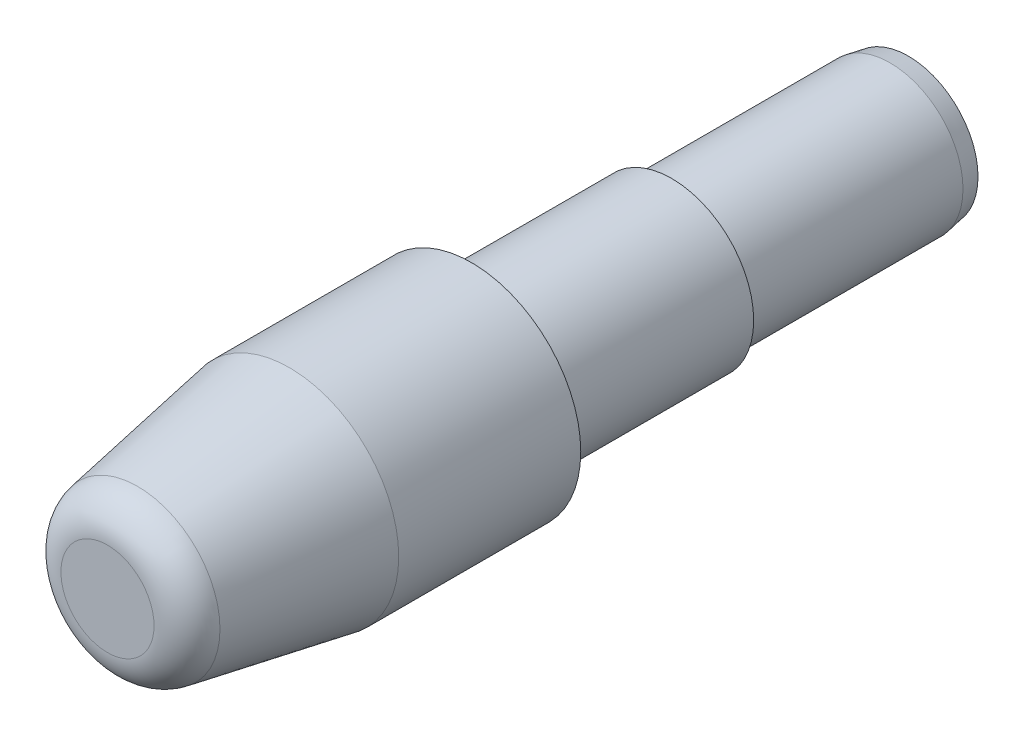
ISO-10303-21;
HEADER;
FILE_DESCRIPTION(('STEP AP214'),'2;1');
FILE_NAME('part.step','',(''),(''),'','','');
FILE_SCHEMA(('AUTOMOTIVE_DESIGN { 1 0 10303 214 1 1 1 1 }'));
ENDSEC;
DATA;
#1=APPLICATION_CONTEXT('core data for automotive mechanical design processes');
#2=APPLICATION_PROTOCOL_DEFINITION('international standard','automotive_design',2000,#1);
#3=PRODUCT_CONTEXT('',#1,'mechanical');
#4=PRODUCT('Part','Part','',(#3));
#5=PRODUCT_RELATED_PRODUCT_CATEGORY('part','',(#4));
#6=PRODUCT_DEFINITION_FORMATION('','',#4);
#7=PRODUCT_DEFINITION_CONTEXT('part definition',#1,'design');
#8=PRODUCT_DEFINITION('design','',#6,#7);
#9=PRODUCT_DEFINITION_SHAPE('','',#8);
#10=(LENGTH_UNIT() NAMED_UNIT(*) SI_UNIT(.MILLI.,.METRE.));
#11=(NAMED_UNIT(*) PLANE_ANGLE_UNIT() SI_UNIT($,.RADIAN.));
#12=(NAMED_UNIT(*) SI_UNIT($,.STERADIAN.) SOLID_ANGLE_UNIT());
#13=UNCERTAINTY_MEASURE_WITH_UNIT(LENGTH_MEASURE(1.E-05),#10,'distance_accuracy_value','');
#14=(GEOMETRIC_REPRESENTATION_CONTEXT(3) GLOBAL_UNCERTAINTY_ASSIGNED_CONTEXT((#13)) GLOBAL_UNIT_ASSIGNED_CONTEXT((#10,
#11,#12)) REPRESENTATION_CONTEXT('',''));
#15=CARTESIAN_POINT('',(0.,0.,0.));
#16=DIRECTION('',(0.,0.,1.));
#17=DIRECTION('',(1.,0.,0.));
#18=AXIS2_PLACEMENT_3D('',#15,#16,#17);
#19=CARTESIAN_POINT('',(0.,0.,-11.));
#20=DIRECTION('',(0.,0.,-1.));
#21=DIRECTION('',(-1.,0.,0.));
#22=AXIS2_PLACEMENT_3D('',#19,#20,#21);
#23=PLANE('',#22);
#24=CARTESIAN_POINT('',(0.,0.,-11.));
#25=DIRECTION('',(0.,0.,-1.));
#26=DIRECTION('',(-1.,0.,0.));
#27=AXIS2_PLACEMENT_3D('',#24,#25,#26);
#28=CIRCLE('',#27,4.5);
#29=CARTESIAN_POINT('',(-4.5,0.,-11.));
#30=VERTEX_POINT('',#29);
#31=EDGE_CURVE('E60',#30,#30,#28,.T.);
#32=ORIENTED_EDGE('',*,*,#31,.T.);
#33=EDGE_LOOP('',(#32));
#34=FACE_BOUND('',#33,.T.);
#35=CARTESIAN_POINT('',(0.,0.,-11.));
#36=DIRECTION('',(0.,0.,-1.));
#37=DIRECTION('',(-1.,0.,0.));
#38=AXIS2_PLACEMENT_3D('',#35,#36,#37);
#39=CIRCLE('',#38,4.);
#40=CARTESIAN_POINT('',(4.,0.,-11.));
#41=VERTEX_POINT('',#40);
#42=EDGE_CURVE('E63',#41,#41,#39,.T.);
#43=ORIENTED_EDGE('',*,*,#42,.F.);
#44=EDGE_LOOP('',(#43));
#45=FACE_BOUND('',#44,.T.);
#46=ADVANCED_FACE('F31',(#34,#45),#23,.T.);
#47=CARTESIAN_POINT('',(0.,0.,0.));
#48=DIRECTION('',(0.,0.,1.));
#49=DIRECTION('',(1.,0.,0.));
#50=AXIS2_PLACEMENT_3D('',#47,#48,#49);
#51=PLANE('',#50);
#52=CARTESIAN_POINT('',(0.,0.,0.));
#53=DIRECTION('',(0.,0.,1.));
#54=DIRECTION('',(1.,0.,0.));
#55=AXIS2_PLACEMENT_3D('',#52,#53,#54);
#56=CIRCLE('',#55,6.);
#57=CARTESIAN_POINT('',(6.,0.,0.));
#58=VERTEX_POINT('',#57);
#59=EDGE_CURVE('E57',#58,#58,#56,.T.);
#60=ORIENTED_EDGE('',*,*,#59,.F.);
#61=EDGE_LOOP('',(#60));
#62=FACE_BOUND('',#61,.T.);
#63=CARTESIAN_POINT('',(0.,0.,0.));
#64=DIRECTION('',(0.,0.,1.));
#65=DIRECTION('',(1.,0.,0.));
#66=AXIS2_PLACEMENT_3D('',#63,#64,#65);
#67=CIRCLE('',#66,4.5);
#68=CARTESIAN_POINT('',(4.5,0.,0.));
#69=VERTEX_POINT('',#68);
#70=EDGE_CURVE('E42',#69,#69,#67,.F.);
#71=ORIENTED_EDGE('',*,*,#70,.F.);
#72=EDGE_LOOP('',(#71));
#73=FACE_BOUND('',#72,.T.);
#74=ADVANCED_FACE('F70',(#62,#73),#51,.F.);
#75=CARTESIAN_POINT('',(0.,0.,10.));
#76=DIRECTION('',(0.,0.,-1.));
#77=DIRECTION('',(-1.,0.,0.));
#78=AXIS2_PLACEMENT_3D('',#75,#76,#77);
#79=CYLINDRICAL_SURFACE('',#78,6.);
#80=CARTESIAN_POINT('',(0.,0.,9.99999999999982));
#81=DIRECTION('',(0.,0.,1.));
#82=DIRECTION('',(1.,0.,0.));
#83=AXIS2_PLACEMENT_3D('',#80,#81,#82);
#84=CIRCLE('',#83,6.);
#85=CARTESIAN_POINT('',(6.,0.,9.99999999999982));
#86=VERTEX_POINT('',#85);
#87=EDGE_CURVE('E54',#86,#86,#84,.F.);
#88=ORIENTED_EDGE('',*,*,#87,.T.);
#89=EDGE_LOOP('',(#88));
#90=FACE_BOUND('',#89,.T.);
#91=ORIENTED_EDGE('',*,*,#59,.T.);
#92=EDGE_LOOP('',(#91));
#93=FACE_BOUND('',#92,.T.);
#94=ADVANCED_FACE('F76',(#90,#93),#79,.T.);
#95=CARTESIAN_POINT('',(0.,0.,20.));
#96=DIRECTION('',(0.,0.,1.));
#97=DIRECTION('',(1.,0.,0.));
#98=AXIS2_PLACEMENT_3D('',#95,#96,#97);
#99=PLANE('',#98);
#100=CARTESIAN_POINT('',(0.,0.,20.));
#101=DIRECTION('',(0.,0.,1.));
#102=DIRECTION('',(1.,0.,0.));
#103=AXIS2_PLACEMENT_3D('',#100,#101,#102);
#104=CIRCLE('',#103,2.55853093056079);
#105=CARTESIAN_POINT('',(2.55853093056079,0.,20.));
#106=VERTEX_POINT('',#105);
#107=EDGE_CURVE('E51',#106,#106,#104,.T.);
#108=ORIENTED_EDGE('',*,*,#107,.T.);
#109=EDGE_LOOP('',(#108));
#110=FACE_BOUND('',#109,.T.);
#111=ADVANCED_FACE('F87',(#110),#99,.T.);
#112=CARTESIAN_POINT('',(0.,0.,20.));
#113=DIRECTION('',(0.,0.,-1.));
#114=DIRECTION('',(-1.,0.,0.));
#115=AXIS2_PLACEMENT_3D('',#112,#113,#114);
#116=CONICAL_SURFACE('',#115,4.23673019291535,0.17453292519943);
#117=CARTESIAN_POINT('',(0.,0.,18.3472963553339));
#118=DIRECTION('',(0.,0.,1.));
#119=DIRECTION('',(1.,0.,0.));
#120=AXIS2_PLACEMENT_3D('',#117,#118,#119);
#121=CIRCLE('',#120,4.5281464365852);
#122=CARTESIAN_POINT('',(4.5281464365852,0.,18.3472963553339));
#123=VERTEX_POINT('',#122);
#124=EDGE_CURVE('E46',#123,#123,#121,.F.);
#125=ORIENTED_EDGE('',*,*,#124,.T.);
#126=EDGE_LOOP('',(#125));
#127=FACE_BOUND('',#126,.T.);
#128=ORIENTED_EDGE('',*,*,#87,.F.);
#129=EDGE_LOOP('',(#128));
#130=FACE_BOUND('',#129,.T.);
#131=ADVANCED_FACE('F89',(#127,#130),#116,.T.);
#132=CARTESIAN_POINT('',(0.,0.,18.));
#133=DIRECTION('',(0.,0.,1.));
#134=DIRECTION('',(1.,0.,0.));
#135=AXIS2_PLACEMENT_3D('',#132,#133,#134);
#136=TOROIDAL_SURFACE('',#135,2.55853093056079,2.);
#137=ORIENTED_EDGE('',*,*,#124,.F.);
#138=EDGE_LOOP('',(#137));
#139=FACE_BOUND('',#138,.T.);
#140=ORIENTED_EDGE('',*,*,#107,.F.);
#141=EDGE_LOOP('',(#140));
#142=FACE_BOUND('',#141,.T.);
#143=ADVANCED_FACE('F85',(#139,#142),#136,.T.);
#144=CARTESIAN_POINT('',(0.,0.,-11.));
#145=DIRECTION('',(0.,0.,1.));
#146=DIRECTION('',(1.,0.,0.));
#147=AXIS2_PLACEMENT_3D('',#144,#145,#146);
#148=CYLINDRICAL_SURFACE('',#147,4.5);
#149=ORIENTED_EDGE('',*,*,#31,.F.);
#150=EDGE_LOOP('',(#149));
#151=FACE_BOUND('',#150,.T.);
#152=ORIENTED_EDGE('',*,*,#70,.T.);
#153=EDGE_LOOP('',(#152));
#154=FACE_BOUND('',#153,.T.);
#155=ADVANCED_FACE('F82',(#151,#154),#148,.T.);
#156=CARTESIAN_POINT('',(0.,0.,-24.));
#157=DIRECTION('',(0.,0.,1.));
#158=DIRECTION('',(1.,0.,0.));
#159=AXIS2_PLACEMENT_3D('',#156,#157,#158);
#160=CYLINDRICAL_SURFACE('',#159,4.);
#161=CARTESIAN_POINT('',(0.,0.,-23.0000000000005));
#162=DIRECTION('',(0.,0.,-1.));
#163=DIRECTION('',(-1.,0.,0.));
#164=AXIS2_PLACEMENT_3D('',#161,#162,#163);
#165=CIRCLE('',#164,4.);
#166=CARTESIAN_POINT('',(4.,0.,-23.0000000000005));
#167=VERTEX_POINT('',#166);
#168=EDGE_CURVE('E10',#167,#167,#165,.F.);
#169=CARTESIAN_POINT('',(4.,0.,-23.0000000000005));
#170=CARTESIAN_POINT('',(4.,0.,-22.8750000000005));
#171=CARTESIAN_POINT('',(4.,0.,-22.7500000000004));
#172=CARTESIAN_POINT('',(4.,0.,-22.5000000000004));
#173=CARTESIAN_POINT('',(4.,0.,-22.3750000000004));
#174=CARTESIAN_POINT('',(4.,0.,-22.1250000000004));
#175=CARTESIAN_POINT('',(4.,0.,-22.0000000000004));
#176=CARTESIAN_POINT('',(4.,0.,-21.7500000000004));
#177=CARTESIAN_POINT('',(4.,0.,-21.6250000000004));
#178=CARTESIAN_POINT('',(4.,0.,-21.3750000000004));
#179=CARTESIAN_POINT('',(4.,0.,-21.2500000000004));
#180=CARTESIAN_POINT('',(4.,0.,-21.0000000000004));
#181=CARTESIAN_POINT('',(4.,0.,-20.8750000000004));
#182=CARTESIAN_POINT('',(4.,0.,-20.6250000000004));
#183=CARTESIAN_POINT('',(4.,0.,-20.5000000000004));
#184=CARTESIAN_POINT('',(4.,0.,-20.2500000000004));
#185=CARTESIAN_POINT('',(4.,0.,-20.1250000000003));
#186=CARTESIAN_POINT('',(4.,0.,-19.8750000000003));
#187=CARTESIAN_POINT('',(4.,0.,-19.7500000000003));
#188=CARTESIAN_POINT('',(4.,0.,-19.5000000000003));
#189=CARTESIAN_POINT('',(4.,0.,-19.3750000000003));
#190=CARTESIAN_POINT('',(4.,0.,-19.1250000000003));
#191=CARTESIAN_POINT('',(4.,0.,-19.0000000000003));
#192=CARTESIAN_POINT('',(4.,0.,-18.7500000000003));
#193=CARTESIAN_POINT('',(4.,0.,-18.6250000000003));
#194=CARTESIAN_POINT('',(4.,0.,-18.3750000000003));
#195=CARTESIAN_POINT('',(4.,0.,-18.2500000000003));
#196=CARTESIAN_POINT('',(4.,0.,-18.0000000000003));
#197=CARTESIAN_POINT('',(4.,0.,-17.8750000000003));
#198=CARTESIAN_POINT('',(4.,0.,-17.6250000000003));
#199=CARTESIAN_POINT('',(4.,0.,-17.5000000000002));
#200=CARTESIAN_POINT('',(4.,0.,-17.2500000000002));
#201=CARTESIAN_POINT('',(4.,0.,-17.1250000000002));
#202=CARTESIAN_POINT('',(4.,0.,-16.8750000000002));
#203=CARTESIAN_POINT('',(4.,0.,-16.7500000000002));
#204=CARTESIAN_POINT('',(4.,0.,-16.5000000000002));
#205=CARTESIAN_POINT('',(4.,0.,-16.3750000000002));
#206=CARTESIAN_POINT('',(4.,0.,-16.1250000000002));
#207=CARTESIAN_POINT('',(4.,0.,-16.0000000000002));
#208=CARTESIAN_POINT('',(4.,0.,-15.7500000000002));
#209=CARTESIAN_POINT('',(4.,0.,-15.6250000000002));
#210=CARTESIAN_POINT('',(4.,0.,-15.3750000000002));
#211=CARTESIAN_POINT('',(4.,0.,-15.2500000000002));
#212=CARTESIAN_POINT('',(4.,0.,-15.0000000000002));
#213=CARTESIAN_POINT('',(4.,0.,-14.8750000000001));
#214=CARTESIAN_POINT('',(4.,0.,-14.6250000000001));
#215=CARTESIAN_POINT('',(4.,0.,-14.5000000000001));
#216=CARTESIAN_POINT('',(4.,0.,-14.2500000000001));
#217=CARTESIAN_POINT('',(4.,0.,-14.1250000000001));
#218=CARTESIAN_POINT('',(4.,0.,-13.8750000000001));
#219=CARTESIAN_POINT('',(4.,0.,-13.7500000000001));
#220=CARTESIAN_POINT('',(4.,0.,-13.5000000000001));
#221=CARTESIAN_POINT('',(4.,0.,-13.3750000000001));
#222=CARTESIAN_POINT('',(4.,0.,-13.1250000000001));
#223=CARTESIAN_POINT('',(4.,0.,-13.0000000000001));
#224=CARTESIAN_POINT('',(4.,0.,-12.7500000000001));
#225=CARTESIAN_POINT('',(4.,0.,-12.6250000000001));
#226=CARTESIAN_POINT('',(4.,0.,-12.375));
#227=CARTESIAN_POINT('',(4.,0.,-12.25));
#228=CARTESIAN_POINT('',(4.,0.,-12.));
#229=CARTESIAN_POINT('',(4.,0.,-11.875));
#230=CARTESIAN_POINT('',(4.,0.,-11.625));
#231=CARTESIAN_POINT('',(4.,0.,-11.5));
#232=CARTESIAN_POINT('',(4.,0.,-11.25));
#233=CARTESIAN_POINT('',(4.,0.,-11.125));
#234=CARTESIAN_POINT('',(4.,0.,-11.));
#235=B_SPLINE_CURVE_WITH_KNOTS('',3,(#169,#170,#171,#172,#173,#174,#175,#176,#177,#178,#179,
#180,#181,#182,#183,#184,#185,#186,#187,#188,#189,#190,#191,#192,#193,#194,#195,#196,#197,#198,
#199,#200,#201,#202,#203,#204,#205,#206,#207,#208,#209,#210,#211,#212,#213,#214,#215,#216,#217,
#218,#219,#220,#221,#222,#223,#224,#225,#226,#227,#228,#229,#230,#231,#232,#233,#234),
.UNSPECIFIED.,.F.,.F.,(4,2,2,2,2,2,2,2,2,2,2,2,2,2,2,2,2,2,2,2,2,2,2,2,2,2,2,2,2,2,2,2,4),(0.,
0.375000000000014,0.750000000000028,1.12500000000004,1.50000000000006,1.87500000000007,
2.25000000000009,2.6250000000001,3.00000000000011,3.37500000000013,3.75000000000014,
4.12500000000016,4.50000000000017,4.87500000000018,5.2500000000002,5.62500000000021,
6.00000000000023,6.37500000000024,6.75000000000026,7.12500000000027,7.50000000000028,
7.8750000000003,8.25000000000031,8.62500000000033,9.00000000000034,9.37500000000036,
9.75000000000037,10.1250000000004,10.5000000000004,10.8750000000004,11.2500000000004,
11.6250000000004,12.0000000000005),.UNSPECIFIED.);
#236=EDGE_CURVE('BSEAM67',#167,#41,#235,.T.);
#237=ORIENTED_EDGE('',*,*,#168,.T.);
#238=ORIENTED_EDGE('',*,*,#42,.T.);
#239=ORIENTED_EDGE('',*,*,#236,.T.);
#240=ORIENTED_EDGE('',*,*,#236,.F.);
#241=EDGE_LOOP('',(#237,#239,#238,#240));
#242=FACE_BOUND('',#241,.T.);
#243=ADVANCED_FACE('F67',(#242),#160,.T.);
#244=CARTESIAN_POINT('',(0.,0.,-24.));
#245=DIRECTION('',(0.,0.,-1.));
#246=DIRECTION('',(-1.,0.,0.));
#247=AXIS2_PLACEMENT_3D('',#244,#245,#246);
#248=PLANE('',#247);
#249=CARTESIAN_POINT('',(0.,0.,-24.));
#250=DIRECTION('',(0.,0.,-1.));
#251=DIRECTION('',(-1.,0.,0.));
#252=AXIS2_PLACEMENT_3D('',#249,#250,#251);
#253=CIRCLE('',#252,3.82367301929162);
#254=CARTESIAN_POINT('',(-3.82367301929162,0.,-24.));
#255=VERTEX_POINT('',#254);
#256=EDGE_CURVE('E38',#255,#255,#253,.T.);
#257=ORIENTED_EDGE('',*,*,#256,.T.);
#258=EDGE_LOOP('',(#257));
#259=FACE_BOUND('',#258,.T.);
#260=ADVANCED_FACE('F124',(#259),#248,.T.);
#261=CARTESIAN_POINT('',(0.,0.,-24.));
#262=DIRECTION('',(0.,0.,1.));
#263=DIRECTION('',(1.,0.,0.));
#264=AXIS2_PLACEMENT_3D('',#261,#262,#263);
#265=CONICAL_SURFACE('',#264,3.82367301929162,0.17453292519943);
#266=ORIENTED_EDGE('',*,*,#168,.F.);
#267=EDGE_LOOP('',(#266));
#268=FACE_BOUND('',#267,.T.);
#269=ORIENTED_EDGE('',*,*,#256,.F.);
#270=EDGE_LOOP('',(#269));
#271=FACE_BOUND('',#270,.T.);
#272=ADVANCED_FACE('F33',(#268,#271),#265,.T.);
#273=CLOSED_SHELL('',(#46,#74,#94,#111,#131,#143,#155,#243,#260,#272));
#274=MANIFOLD_SOLID_BREP('B2',#273);
#275=ADVANCED_BREP_SHAPE_REPRESENTATION('',(#18,#274),#14);
#276=SHAPE_DEFINITION_REPRESENTATION(#9,#275);
ENDSEC;
END-ISO-10303-21;
